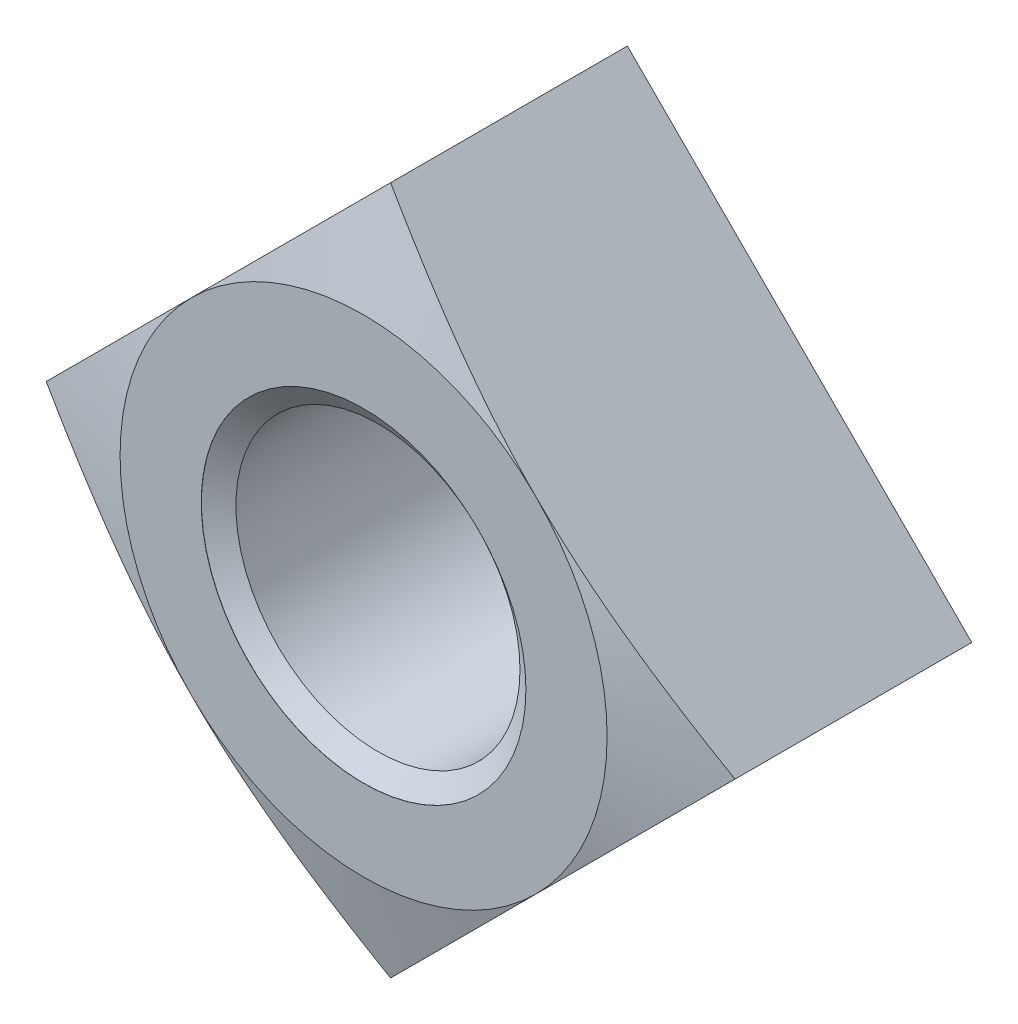
ISO-10303-21;
HEADER;
FILE_DESCRIPTION(('STEP AP214'),'2;1');
FILE_NAME('part.step','',(''),(''),'','','');
FILE_SCHEMA(('AUTOMOTIVE_DESIGN { 1 0 10303 214 1 1 1 1 }'));
ENDSEC;
DATA;
#1=APPLICATION_CONTEXT('core data for automotive mechanical design processes');
#2=APPLICATION_PROTOCOL_DEFINITION('international standard','automotive_design',2000,#1);
#3=PRODUCT_CONTEXT('',#1,'mechanical');
#4=PRODUCT('Part','Part','',(#3));
#5=PRODUCT_RELATED_PRODUCT_CATEGORY('part','',(#4));
#6=PRODUCT_DEFINITION_FORMATION('','',#4);
#7=PRODUCT_DEFINITION_CONTEXT('part definition',#1,'design');
#8=PRODUCT_DEFINITION('design','',#6,#7);
#9=PRODUCT_DEFINITION_SHAPE('','',#8);
#10=(LENGTH_UNIT() NAMED_UNIT(*) SI_UNIT(.MILLI.,.METRE.));
#11=(NAMED_UNIT(*) PLANE_ANGLE_UNIT() SI_UNIT($,.RADIAN.));
#12=(NAMED_UNIT(*) SI_UNIT($,.STERADIAN.) SOLID_ANGLE_UNIT());
#13=UNCERTAINTY_MEASURE_WITH_UNIT(LENGTH_MEASURE(1.E-05),#10,'distance_accuracy_value','');
#14=(GEOMETRIC_REPRESENTATION_CONTEXT(3) GLOBAL_UNCERTAINTY_ASSIGNED_CONTEXT((#13)) GLOBAL_UNIT_ASSIGNED_CONTEXT((#10,
#11,#12)) REPRESENTATION_CONTEXT('',''));
#15=CARTESIAN_POINT('',(0.,0.,0.));
#16=DIRECTION('',(0.,0.,1.));
#17=DIRECTION('',(1.,0.,0.));
#18=AXIS2_PLACEMENT_3D('',#15,#16,#17);
#19=CARTESIAN_POINT('',(0.,0.,-13.));
#20=DIRECTION('',(0.,0.,1.));
#21=DIRECTION('',(1.,0.,0.));
#22=AXIS2_PLACEMENT_3D('',#19,#20,#21);
#23=CYLINDRICAL_SURFACE('',#22,7.);
#24=CARTESIAN_POINT('',(0.,0.,-0.708207538209701));
#25=DIRECTION('',(0.,0.,1.));
#26=DIRECTION('',(1.,0.,0.));
#27=AXIS2_PLACEMENT_3D('',#24,#25,#26);
#28=CIRCLE('',#27,7.);
#29=CARTESIAN_POINT('',(7.,0.,-0.708207538209701));
#30=VERTEX_POINT('',#29);
#31=EDGE_CURVE('E172',#30,#30,#28,.F.);
#32=CARTESIAN_POINT('',(0.,0.,-12.2907924617903));
#33=DIRECTION('',(0.,0.,-1.));
#34=DIRECTION('',(-1.,0.,0.));
#35=AXIS2_PLACEMENT_3D('',#32,#33,#34);
#36=CIRCLE('',#35,7.);
#37=CARTESIAN_POINT('',(7.,0.,-12.2907924617903));
#38=VERTEX_POINT('',#37);
#39=EDGE_CURVE('E39',#38,#38,#36,.F.);
#40=CARTESIAN_POINT('',(7.,0.,-0.708207538209701));
#41=CARTESIAN_POINT('',(7.,0.,-0.828859464496999));
#42=CARTESIAN_POINT('',(7.,0.,-0.949511390784297));
#43=CARTESIAN_POINT('',(7.,0.,-1.19081524335889));
#44=CARTESIAN_POINT('',(7.,0.,-1.31146716964619));
#45=CARTESIAN_POINT('',(7.,0.,-1.55277102222079));
#46=CARTESIAN_POINT('',(7.,0.,-1.67342294850808));
#47=CARTESIAN_POINT('',(7.,0.,-1.91472680108268));
#48=CARTESIAN_POINT('',(7.,0.,-2.03537872736998));
#49=CARTESIAN_POINT('',(7.,0.,-2.27668257994457));
#50=CARTESIAN_POINT('',(7.,0.,-2.39733450623187));
#51=CARTESIAN_POINT('',(7.,0.,-2.63863835880647));
#52=CARTESIAN_POINT('',(7.,0.,-2.75929028509376));
#53=CARTESIAN_POINT('',(7.,0.,-3.00059413766836));
#54=CARTESIAN_POINT('',(7.,0.,-3.12124606395566));
#55=CARTESIAN_POINT('',(7.,0.,-3.36254991653025));
#56=CARTESIAN_POINT('',(7.,0.,-3.48320184281755));
#57=CARTESIAN_POINT('',(7.,0.,-3.72450569539215));
#58=CARTESIAN_POINT('',(7.,0.,-3.84515762167944));
#59=CARTESIAN_POINT('',(7.,0.,-4.08646147425404));
#60=CARTESIAN_POINT('',(7.,0.,-4.20711340054134));
#61=CARTESIAN_POINT('',(7.,0.,-4.44841725311593));
#62=CARTESIAN_POINT('',(7.,0.,-4.56906917940323));
#63=CARTESIAN_POINT('',(7.,0.,-4.81037303197783));
#64=CARTESIAN_POINT('',(7.,0.,-4.93102495826512));
#65=CARTESIAN_POINT('',(7.,0.,-5.17232881083972));
#66=CARTESIAN_POINT('',(7.,0.,-5.29298073712702));
#67=CARTESIAN_POINT('',(7.,0.,-5.53428458970161));
#68=CARTESIAN_POINT('',(7.,0.,-5.65493651598891));
#69=CARTESIAN_POINT('',(7.,0.,-5.89624036856351));
#70=CARTESIAN_POINT('',(7.,0.,-6.0168922948508));
#71=CARTESIAN_POINT('',(7.,0.,-6.2581961474254));
#72=CARTESIAN_POINT('',(7.,0.,-6.3788480737127));
#73=CARTESIAN_POINT('',(7.,0.,-6.62015192628729));
#74=CARTESIAN_POINT('',(7.,0.,-6.74080385257459));
#75=CARTESIAN_POINT('',(7.,0.,-6.98210770514919));
#76=CARTESIAN_POINT('',(7.,0.,-7.10275963143649));
#77=CARTESIAN_POINT('',(7.,0.,-7.34406348401108));
#78=CARTESIAN_POINT('',(7.,0.,-7.46471541029838));
#79=CARTESIAN_POINT('',(7.,0.,-7.70601926287297));
#80=CARTESIAN_POINT('',(7.,0.,-7.82667118916027));
#81=CARTESIAN_POINT('',(7.,0.,-8.06797504173487));
#82=CARTESIAN_POINT('',(7.,0.,-8.18862696802216));
#83=CARTESIAN_POINT('',(7.,0.,-8.42993082059676));
#84=CARTESIAN_POINT('',(7.,0.,-8.55058274688406));
#85=CARTESIAN_POINT('',(7.,0.,-8.79188659945865));
#86=CARTESIAN_POINT('',(7.,0.,-8.91253852574595));
#87=CARTESIAN_POINT('',(7.,0.,-9.15384237832055));
#88=CARTESIAN_POINT('',(7.,0.,-9.27449430460785));
#89=CARTESIAN_POINT('',(7.,0.,-9.51579815718244));
#90=CARTESIAN_POINT('',(7.,0.,-9.63645008346974));
#91=CARTESIAN_POINT('',(7.,0.,-9.87775393604433));
#92=CARTESIAN_POINT('',(7.,0.,-9.99840586233163));
#93=CARTESIAN_POINT('',(7.,0.,-10.2397097149062));
#94=CARTESIAN_POINT('',(7.,0.,-10.3603616411935));
#95=CARTESIAN_POINT('',(7.,0.,-10.6016654937681));
#96=CARTESIAN_POINT('',(7.,0.,-10.7223174200554));
#97=CARTESIAN_POINT('',(7.,0.,-10.96362127263));
#98=CARTESIAN_POINT('',(7.,0.,-11.0842731989173));
#99=CARTESIAN_POINT('',(7.,0.,-11.3255770514919));
#100=CARTESIAN_POINT('',(7.,0.,-11.4462289777792));
#101=CARTESIAN_POINT('',(7.,0.,-11.6875328303538));
#102=CARTESIAN_POINT('',(7.,0.,-11.8081847566411));
#103=CARTESIAN_POINT('',(7.,0.,-12.0494886092157));
#104=CARTESIAN_POINT('',(7.,0.,-12.170140535503));
#105=CARTESIAN_POINT('',(7.,0.,-12.2907924617903));
#106=B_SPLINE_CURVE_WITH_KNOTS('',3,(#40,#41,#42,#43,#44,#45,#46,#47,#48,#49,#50,#51,#52,#53,
#54,#55,#56,#57,#58,#59,#60,#61,#62,#63,#64,#65,#66,#67,#68,#69,#70,#71,#72,#73,#74,#75,#76,#77,
#78,#79,#80,#81,#82,#83,#84,#85,#86,#87,#88,#89,#90,#91,#92,#93,#94,#95,#96,#97,#98,#99,#100,
#101,#102,#103,#104,#105),.UNSPECIFIED.,.F.,.F.,(4,2,2,2,2,2,2,2,2,2,2,2,2,2,2,2,2,2,2,2,2,2,2,
2,2,2,2,2,2,2,2,2,4),(0.,0.361955778861894,0.723911557723786,1.08586733658568,1.44782311544757,
1.80977889430947,2.17173467317136,2.53369045203325,2.89564623089515,3.25760200975704,
3.61955778861893,3.98151356748083,4.34346934634272,4.70542512520461,5.06738090406651,
5.4293366829284,5.79129246179029,6.15324824065219,6.51520401951408,6.87715979837597,
7.23911557723787,7.60107135609976,7.96302713496165,8.32498291382355,8.68693869268544,
9.04889447154733,9.41085025040923,9.77280602927112,10.134761808133,10.4967175869949,
10.8586733658568,11.2206291447187,11.5825849235806),.UNSPECIFIED.);
#107=EDGE_CURVE('BSEAM34',#30,#38,#106,.T.);
#108=ORIENTED_EDGE('',*,*,#31,.F.);
#109=ORIENTED_EDGE('',*,*,#39,.F.);
#110=ORIENTED_EDGE('',*,*,#107,.T.);
#111=ORIENTED_EDGE('',*,*,#107,.F.);
#112=EDGE_LOOP('',(#108,#110,#109,#111));
#113=FACE_BOUND('',#112,.T.);
#114=ADVANCED_FACE('F34',(#113),#23,.F.);
#115=CARTESIAN_POINT('',(0.,-16.9705627484771,-13.));
#116=DIRECTION('',(0.707106781186548,-0.707106781186547,0.));
#117=DIRECTION('',(0.707106781186547,0.707106781186548,0.));
#118=AXIS2_PLACEMENT_3D('',#115,#116,#117);
#119=PLANE('',#118);
#120=DIRECTION('',(0.,0.,1.));
#121=VECTOR('',#120,1.);
#122=CARTESIAN_POINT('',(16.9705627484771,0.,-13.));
#123=LINE('',#122,#121);
#124=CARTESIAN_POINT('',(16.9705627484771,0.,-13.));
#125=VERTEX_POINT('',#124);
#126=CARTESIAN_POINT('',(16.9705627484771,0.,-1.33185827438266));
#127=VERTEX_POINT('',#126);
#128=EDGE_CURVE('E163',#125,#127,#123,.T.);
#129=ORIENTED_EDGE('',*,*,#128,.T.);
#130=CARTESIAN_POINT('',(16.9707627484771,0.000200000000001266,-1.33191186453692));
#131=CARTESIAN_POINT('',(16.7160871689827,-0.254475579494484,-1.26368267582354));
#132=CARTESIAN_POINT('',(16.4612127638952,-0.509349984581982,-1.19691326985119));
#133=CARTESIAN_POINT('',(15.9510162592175,-1.01954648925967,-1.0667933943211));
#134=CARTESIAN_POINT('',(15.6956941392983,-1.27486860917886,-1.00344308439163));
#135=CARTESIAN_POINT('',(15.1844078591732,-1.78615488930396,-0.880626862455069));
#136=CARTESIAN_POINT('',(14.9284433871733,-2.04211936130388,-0.821163532213176));
#137=CARTESIAN_POINT('',(14.4160134005023,-2.55454934797482,-0.706762615968221));
#138=CARTESIAN_POINT('',(14.1595478915117,-2.81101485696542,-0.651824978957183));
#139=CARTESIAN_POINT('',(13.3887812697204,-3.58178147875671,-0.494643727278841));
#140=CARTESIAN_POINT('',(12.8736681962786,-4.09689455219855,-0.400168632033365));
#141=CARTESIAN_POINT('',(11.841395432082,-5.1291673163951,-0.237805323419943));
#142=CARTESIAN_POINT('',(11.3242362040809,-5.64632654439629,-0.169911410884996));
#143=CARTESIAN_POINT('',(10.5512179903715,-6.4193447581056,-0.0926130125675545));
#144=CARTESIAN_POINT('',(10.2959571207786,-6.67460562769855,-0.0710120553962755));
#145=CARTESIAN_POINT('',(9.78514714254055,-7.18541560593659,-0.036117858776914));
#146=CARTESIAN_POINT('',(9.5295980345371,-7.44096471394004,-0.022824600871827));
#147=CARTESIAN_POINT('',(9.01834367853458,-7.95221906994257,-0.0048944478908159));
#148=CARTESIAN_POINT('',(8.76263842835409,-8.20792432012305,-0.000257676654077014));
#149=CARTESIAN_POINT('',(8.25122407475896,-8.71933867371819,0.000236744622834916));
#150=CARTESIAN_POINT('',(7.99551497134956,-8.97504777712758,-0.00390559428812388));
#151=CARTESIAN_POINT('',(7.48449927368456,-9.48606347479259,-0.0208514195087557));
#152=CARTESIAN_POINT('',(7.22919253390913,-9.74137021456801,-0.0336461412863514));
#153=CARTESIAN_POINT('',(6.71886010607429,-10.2517026424028,-0.0675520992348062));
#154=CARTESIAN_POINT('',(6.46383441994363,-10.5067283285335,-0.0886633921262399));
#155=CARTESIAN_POINT('',(5.69934239699318,-11.271220351484,-0.163734393907898));
#156=CARTESIAN_POINT('',(5.19043259389555,-11.7801301545816,-0.229432271020398));
#157=CARTESIAN_POINT('',(4.4868931773749,-12.4836695711022,-0.338449897497542));
#158=CARTESIAN_POINT('',(4.29135123541936,-12.6792115130578,-0.370704695444403));
#159=CARTESIAN_POINT('',(3.90058562169434,-13.0699771267828,-0.438740581818086));
#160=CARTESIAN_POINT('',(3.70536192766991,-13.2652008208072,-0.474521411882843));
#161=CARTESIAN_POINT('',(3.12010609596811,-13.850456652509,-0.586688719894474));
#162=CARTESIAN_POINT('',(2.73053498855165,-14.2400277599255,-0.66789277162461));
#163=CARTESIAN_POINT('',(1.95007997316359,-15.0204827753136,-0.841333622914572));
#164=CARTESIAN_POINT('',(1.55920362423867,-15.4113591242385,-0.933637717196592));
#165=CARTESIAN_POINT('',(0.973762906128067,-15.9967998423491,-1.07850911954513));
#166=CARTESIAN_POINT('',(0.778796386350297,-16.1917663621268,-1.12785940828177));
#167=CARTESIAN_POINT('',(0.389114832454074,-16.5814479160231,-1.2284905074395));
#168=CARTESIAN_POINT('',(0.194399795370428,-16.7761629531067,-1.27977129487944));
#169=CARTESIAN_POINT('',(-0.000199999999999715,-16.9707627484771,-1.33191186453692));
#170=B_SPLINE_CURVE_WITH_KNOTS('',3,(#130,#131,#132,#133,#134,#135,#136,#137,#138,#139,#140,
#141,#142,#143,#144,#145,#146,#147,#148,#149,#150,#151,#152,#153,#154,#155,#156,#157,#158,#159,
#160,#161,#162,#163,#164,#165,#166,#167,#168,#169),.UNSPECIFIED.,.F.,.F.,(4,2,2,2,2,2,2,2,2,2,2,
2,2,2,2,2,2,2,2,4),(0.,1.09971744747032,2.19948619341731,3.29997814453787,4.40045769058671,
6.60381929577945,8.80670822781167,9.89154414633702,10.9763776547014,12.0612266825107,
13.1460743449941,14.2298247412125,15.3135825289398,17.4809772471889,18.3162064511189,
19.1513745009496,20.8219059859292,22.5031307537072,23.3434429539036,24.1837451539676),.UNSPECIFIED.);
#171=CARTESIAN_POINT('',(8.48528137423857,-8.48528137423857,0.));
#172=VERTEX_POINT('',#171);
#173=EDGE_CURVE('E60',#127,#172,#170,.T.);
#174=ORIENTED_EDGE('',*,*,#173,.T.);
#175=CARTESIAN_POINT('',(0.,-16.9705627484771,-1.33185827438266));
#176=VERTEX_POINT('',#175);
#177=EDGE_CURVE('E146',#172,#176,#170,.T.);
#178=ORIENTED_EDGE('',*,*,#177,.T.);
#179=DIRECTION('',(0.,0.,1.));
#180=VECTOR('',#179,1.);
#181=CARTESIAN_POINT('',(0.,-16.9705627484771,-13.));
#182=LINE('',#181,#180);
#183=CARTESIAN_POINT('',(0.,-16.9705627484771,-13.));
#184=VERTEX_POINT('',#183);
#185=EDGE_CURVE('E164',#184,#176,#182,.T.);
#186=ORIENTED_EDGE('',*,*,#185,.F.);
#187=DIRECTION('',(0.707106781186547,0.707106781186548,0.));
#188=VECTOR('',#187,1.);
#189=CARTESIAN_POINT('',(0.,-16.9705627484771,-13.));
#190=LINE('',#189,#188);
#191=EDGE_CURVE('E152',#184,#125,#190,.T.);
#192=ORIENTED_EDGE('',*,*,#191,.T.);
#193=EDGE_LOOP('',(#129,#174,#178,#186,#192));
#194=FACE_BOUND('',#193,.T.);
#195=ADVANCED_FACE('F36',(#194),#119,.T.);
#196=CARTESIAN_POINT('',(-16.9705627484771,0.,-13.));
#197=DIRECTION('',(-0.707106781186548,-0.707106781186547,0.));
#198=DIRECTION('',(0.707106781186547,-0.707106781186548,0.));
#199=AXIS2_PLACEMENT_3D('',#196,#197,#198);
#200=PLANE('',#199);
#201=ORIENTED_EDGE('',*,*,#185,.T.);
#202=CARTESIAN_POINT('',(0.000200000000000619,-16.9707627484771,-1.33191186453692));
#203=CARTESIAN_POINT('',(-0.254475579494483,-16.7160871689827,-1.26368267582354));
#204=CARTESIAN_POINT('',(-0.509349984581981,-16.4612127638952,-1.19691326985119));
#205=CARTESIAN_POINT('',(-1.01954648925967,-15.9510162592175,-1.0667933943211));
#206=CARTESIAN_POINT('',(-1.27486860917886,-15.6956941392983,-1.00344308439164));
#207=CARTESIAN_POINT('',(-1.78615488930397,-15.1844078591732,-0.880626862455071));
#208=CARTESIAN_POINT('',(-2.04211936130388,-14.9284433871733,-0.821163532213177));
#209=CARTESIAN_POINT('',(-2.55454934797483,-14.4160134005023,-0.706762615968221));
#210=CARTESIAN_POINT('',(-2.81101485696542,-14.1595478915117,-0.651824978957184));
#211=CARTESIAN_POINT('',(-3.58178147875671,-13.3887812697204,-0.494643727278842));
#212=CARTESIAN_POINT('',(-4.09689455219855,-12.8736681962786,-0.400168632033366));
#213=CARTESIAN_POINT('',(-5.1291673163951,-11.8413954320821,-0.237805323419944));
#214=CARTESIAN_POINT('',(-5.64632654439629,-11.3242362040809,-0.169911410884997));
#215=CARTESIAN_POINT('',(-6.4193447581056,-10.5512179903715,-0.092613012567555));
#216=CARTESIAN_POINT('',(-6.67460562769855,-10.2959571207786,-0.0710120553962758));
#217=CARTESIAN_POINT('',(-7.18541560593659,-9.78514714254056,-0.0361178587769143));
#218=CARTESIAN_POINT('',(-7.44096471394004,-9.5295980345371,-0.0228246008718276));
#219=CARTESIAN_POINT('',(-7.95221906994257,-9.01834367853458,-0.00489444789081629));
#220=CARTESIAN_POINT('',(-8.20792432012305,-8.7626384283541,-0.000257676654077003));
#221=CARTESIAN_POINT('',(-8.71933867371818,-8.25122407475896,0.000236744622834906));
#222=CARTESIAN_POINT('',(-8.97504777712758,-7.99551497134956,-0.00390559428812433));
#223=CARTESIAN_POINT('',(-9.48606347479259,-7.48449927368456,-0.0208514195087566));
#224=CARTESIAN_POINT('',(-9.74137021456802,-7.22919253390913,-0.0336461412863523));
#225=CARTESIAN_POINT('',(-10.2517026424028,-6.7188601060743,-0.0675520992348067));
#226=CARTESIAN_POINT('',(-10.5067283285335,-6.46383441994363,-0.08866339212624));
#227=CARTESIAN_POINT('',(-11.271220351484,-5.69934239699318,-0.163734393907897));
#228=CARTESIAN_POINT('',(-11.7801301545816,-5.19043259389555,-0.229432271020399));
#229=CARTESIAN_POINT('',(-12.4836695711023,-4.48689317737489,-0.338449897497543));
#230=CARTESIAN_POINT('',(-12.6792115130578,-4.29135123541936,-0.370704695444404));
#231=CARTESIAN_POINT('',(-13.0699771267828,-3.90058562169433,-0.438740581818087));
#232=CARTESIAN_POINT('',(-13.2652008208072,-3.70536192766991,-0.474521411882843));
#233=CARTESIAN_POINT('',(-13.850456652509,-3.12010609596811,-0.586688719894475));
#234=CARTESIAN_POINT('',(-14.2400277599255,-2.73053498855165,-0.667892771624611));
#235=CARTESIAN_POINT('',(-15.0204827753136,-1.95007997316358,-0.841333622914571));
#236=CARTESIAN_POINT('',(-15.4113591242385,-1.55920362423867,-0.933637717196592));
#237=CARTESIAN_POINT('',(-15.9967998423491,-0.973762906128066,-1.07850911954513));
#238=CARTESIAN_POINT('',(-16.1917663621268,-0.778796386350297,-1.12785940828177));
#239=CARTESIAN_POINT('',(-16.5814479160231,-0.389114832454074,-1.2284905074395));
#240=CARTESIAN_POINT('',(-16.7761629531067,-0.194399795370428,-1.27977129487944));
#241=CARTESIAN_POINT('',(-16.9707627484771,0.000200000000000152,-1.33191186453692));
#242=B_SPLINE_CURVE_WITH_KNOTS('',3,(#202,#203,#204,#205,#206,#207,#208,#209,#210,#211,#212,
#213,#214,#215,#216,#217,#218,#219,#220,#221,#222,#223,#224,#225,#226,#227,#228,#229,#230,#231,
#232,#233,#234,#235,#236,#237,#238,#239,#240,#241),.UNSPECIFIED.,.F.,.F.,(4,2,2,2,2,2,2,2,2,2,2,
2,2,2,2,2,2,2,2,4),(0.,1.09971744747032,2.19948619341731,3.29997814453788,4.40045769058671,
6.60381929577945,8.80670822781167,9.89154414633702,10.9763776547014,12.0612266825107,
13.1460743449941,14.2298247412125,15.3135825289398,17.4809772471889,18.3162064511189,
19.1513745009496,20.8219059859292,22.5031307537072,23.3434429539036,24.1837451539676),.UNSPECIFIED.);
#243=CARTESIAN_POINT('',(-8.48528137423857,-8.48528137423857,0.));
#244=VERTEX_POINT('',#243);
#245=EDGE_CURVE('E117',#176,#244,#242,.T.);
#246=ORIENTED_EDGE('',*,*,#245,.T.);
#247=CARTESIAN_POINT('',(-16.9705627484771,0.,-1.33185827438266));
#248=VERTEX_POINT('',#247);
#249=EDGE_CURVE('E103',#244,#248,#242,.T.);
#250=ORIENTED_EDGE('',*,*,#249,.T.);
#251=DIRECTION('',(0.,0.,1.));
#252=VECTOR('',#251,1.);
#253=CARTESIAN_POINT('',(-16.9705627484771,0.,-13.));
#254=LINE('',#253,#252);
#255=CARTESIAN_POINT('',(-16.9705627484771,0.,-13.));
#256=VERTEX_POINT('',#255);
#257=EDGE_CURVE('E116',#256,#248,#254,.T.);
#258=ORIENTED_EDGE('',*,*,#257,.F.);
#259=DIRECTION('',(0.707106781186547,-0.707106781186548,0.));
#260=VECTOR('',#259,1.);
#261=CARTESIAN_POINT('',(-16.9705627484771,0.,-13.));
#262=LINE('',#261,#260);
#263=EDGE_CURVE('E160',#256,#184,#262,.T.);
#264=ORIENTED_EDGE('',*,*,#263,.T.);
#265=EDGE_LOOP('',(#201,#246,#250,#258,#264));
#266=FACE_BOUND('',#265,.T.);
#267=ADVANCED_FACE('F209',(#266),#200,.T.);
#268=CARTESIAN_POINT('',(0.,16.9705627484771,-13.));
#269=DIRECTION('',(-0.707106781186548,0.707106781186548,0.));
#270=DIRECTION('',(-0.707106781186548,-0.707106781186548,0.));
#271=AXIS2_PLACEMENT_3D('',#268,#269,#270);
#272=PLANE('',#271);
#273=ORIENTED_EDGE('',*,*,#257,.T.);
#274=CARTESIAN_POINT('',(-16.9707627484771,-0.000199999999998812,-1.33191186453692));
#275=CARTESIAN_POINT('',(-16.7160871689827,0.254475579494485,-1.26368267582354));
#276=CARTESIAN_POINT('',(-16.4612127638952,0.509349984581982,-1.19691326985119));
#277=CARTESIAN_POINT('',(-15.9510162592175,1.01954648925967,-1.0667933943211));
#278=CARTESIAN_POINT('',(-15.6956941392983,1.27486860917886,-1.00344308439163));
#279=CARTESIAN_POINT('',(-15.1844078591732,1.78615488930397,-0.88062686245507));
#280=CARTESIAN_POINT('',(-14.9284433871733,2.04211936130389,-0.821163532213177));
#281=CARTESIAN_POINT('',(-14.4160134005023,2.55454934797483,-0.706762615968221));
#282=CARTESIAN_POINT('',(-14.1595478915117,2.81101485696542,-0.651824978957183));
#283=CARTESIAN_POINT('',(-13.3887812697204,3.58178147875671,-0.494643727278841));
#284=CARTESIAN_POINT('',(-12.8736681962786,4.09689455219855,-0.400168632033366));
#285=CARTESIAN_POINT('',(-11.841395432082,5.1291673163951,-0.237805323419944));
#286=CARTESIAN_POINT('',(-11.3242362040809,5.64632654439629,-0.169911410884996));
#287=CARTESIAN_POINT('',(-10.5512179903715,6.4193447581056,-0.0926130125675545));
#288=CARTESIAN_POINT('',(-10.2959571207786,6.67460562769855,-0.0710120553962755));
#289=CARTESIAN_POINT('',(-9.78514714254055,7.18541560593659,-0.0361178587769141));
#290=CARTESIAN_POINT('',(-9.5295980345371,7.44096471394004,-0.0228246008718273));
#291=CARTESIAN_POINT('',(-9.01834367853458,7.95221906994257,-0.00489444789081609));
#292=CARTESIAN_POINT('',(-8.76263842835409,8.20792432012305,-0.000257676654076991));
#293=CARTESIAN_POINT('',(-8.25122407475896,8.71933867371819,0.000236744622834893));
#294=CARTESIAN_POINT('',(-7.99551497134956,8.97504777712758,-0.00390559428812419));
#295=CARTESIAN_POINT('',(-7.48449927368456,9.48606347479259,-0.0208514195087562));
#296=CARTESIAN_POINT('',(-7.22919253390913,9.74137021456802,-0.0336461412863519));
#297=CARTESIAN_POINT('',(-6.71886010607429,10.2517026424028,-0.0675520992348066));
#298=CARTESIAN_POINT('',(-6.46383441994363,10.5067283285335,-0.0886633921262402));
#299=CARTESIAN_POINT('',(-5.69934239699318,11.271220351484,-0.163734393907898));
#300=CARTESIAN_POINT('',(-5.19043259389555,11.7801301545816,-0.229432271020398));
#301=CARTESIAN_POINT('',(-4.4868931773749,12.4836695711022,-0.338449897497542));
#302=CARTESIAN_POINT('',(-4.29135123541936,12.6792115130578,-0.370704695444404));
#303=CARTESIAN_POINT('',(-3.90058562169434,13.0699771267828,-0.438740581818087));
#304=CARTESIAN_POINT('',(-3.70536192766991,13.2652008208072,-0.474521411882843));
#305=CARTESIAN_POINT('',(-3.12010609596811,13.850456652509,-0.586688719894474));
#306=CARTESIAN_POINT('',(-2.73053498855165,14.2400277599255,-0.66789277162461));
#307=CARTESIAN_POINT('',(-1.95007997316359,15.0204827753136,-0.841333622914571));
#308=CARTESIAN_POINT('',(-1.55920362423867,15.4113591242385,-0.933637717196592));
#309=CARTESIAN_POINT('',(-0.973762906128068,15.9967998423491,-1.07850911954513));
#310=CARTESIAN_POINT('',(-0.778796386350299,16.1917663621268,-1.12785940828177));
#311=CARTESIAN_POINT('',(-0.389114832454076,16.5814479160231,-1.2284905074395));
#312=CARTESIAN_POINT('',(-0.19439979537043,16.7761629531067,-1.27977129487944));
#313=CARTESIAN_POINT('',(0.000199999999997541,16.9707627484771,-1.33191186453692));
#314=B_SPLINE_CURVE_WITH_KNOTS('',3,(#274,#275,#276,#277,#278,#279,#280,#281,#282,#283,#284,
#285,#286,#287,#288,#289,#290,#291,#292,#293,#294,#295,#296,#297,#298,#299,#300,#301,#302,#303,
#304,#305,#306,#307,#308,#309,#310,#311,#312,#313),.UNSPECIFIED.,.F.,.F.,(4,2,2,2,2,2,2,2,2,2,2,
2,2,2,2,2,2,2,2,4),(0.,1.09971744747031,2.19948619341731,3.29997814453787,4.40045769058671,
6.60381929577945,8.80670822781167,9.89154414633702,10.9763776547014,12.0612266825107,
13.1460743449941,14.2298247412125,15.3135825289398,17.4809772471889,18.3162064511189,
19.1513745009496,20.8219059859292,22.5031307537072,23.3434429539035,24.1837451539676),.UNSPECIFIED.);
#315=CARTESIAN_POINT('',(-8.48528137423857,8.48528137423857,0.));
#316=VERTEX_POINT('',#315);
#317=EDGE_CURVE('E98',#248,#316,#314,.T.);
#318=ORIENTED_EDGE('',*,*,#317,.T.);
#319=CARTESIAN_POINT('',(0.,16.9705627484771,-1.33185827438266));
#320=VERTEX_POINT('',#319);
#321=EDGE_CURVE('E90',#316,#320,#314,.T.);
#322=ORIENTED_EDGE('',*,*,#321,.T.);
#323=DIRECTION('',(0.,0.,1.));
#324=VECTOR('',#323,1.);
#325=CARTESIAN_POINT('',(0.,16.9705627484771,-13.));
#326=LINE('',#325,#324);
#327=CARTESIAN_POINT('',(0.,16.9705627484771,-13.));
#328=VERTEX_POINT('',#327);
#329=EDGE_CURVE('E168',#328,#320,#326,.T.);
#330=ORIENTED_EDGE('',*,*,#329,.F.);
#331=DIRECTION('',(-0.707106781186547,-0.707106781186547,0.));
#332=VECTOR('',#331,1.);
#333=CARTESIAN_POINT('',(0.,16.9705627484771,-13.));
#334=LINE('',#333,#332);
#335=EDGE_CURVE('E158',#328,#256,#334,.T.);
#336=ORIENTED_EDGE('',*,*,#335,.T.);
#337=EDGE_LOOP('',(#273,#318,#322,#330,#336));
#338=FACE_BOUND('',#337,.T.);
#339=ADVANCED_FACE('F114',(#338),#272,.T.);
#340=CARTESIAN_POINT('',(16.9705627484771,0.,-13.));
#341=DIRECTION('',(0.707106781186548,0.707106781186548,0.));
#342=DIRECTION('',(-0.707106781186548,0.707106781186548,0.));
#343=AXIS2_PLACEMENT_3D('',#340,#341,#342);
#344=PLANE('',#343);
#345=ORIENTED_EDGE('',*,*,#329,.T.);
#346=CARTESIAN_POINT('',(-0.000200000000001822,16.9707627484771,-1.33191186453692));
#347=CARTESIAN_POINT('',(0.254475579494483,16.7160871689827,-1.26368267582354));
#348=CARTESIAN_POINT('',(0.50934998458198,16.4612127638952,-1.19691326985119));
#349=CARTESIAN_POINT('',(1.01954648925967,15.9510162592175,-1.0667933943211));
#350=CARTESIAN_POINT('',(1.27486860917886,15.6956941392983,-1.00344308439163));
#351=CARTESIAN_POINT('',(1.78615488930396,15.1844078591732,-0.880626862455071));
#352=CARTESIAN_POINT('',(2.04211936130388,14.9284433871733,-0.821163532213177));
#353=CARTESIAN_POINT('',(2.55454934797482,14.4160134005023,-0.706762615968221));
#354=CARTESIAN_POINT('',(2.81101485696542,14.1595478915117,-0.651824978957183));
#355=CARTESIAN_POINT('',(3.5817814787567,13.3887812697204,-0.49464372727884));
#356=CARTESIAN_POINT('',(4.09689455219855,12.8736681962786,-0.400168632033365));
#357=CARTESIAN_POINT('',(5.1291673163951,11.841395432082,-0.237805323419943));
#358=CARTESIAN_POINT('',(5.64632654439629,11.3242362040809,-0.169911410884995));
#359=CARTESIAN_POINT('',(6.4193447581056,10.5512179903715,-0.0926130125675549));
#360=CARTESIAN_POINT('',(6.67460562769855,10.2959571207786,-0.0710120553962764));
#361=CARTESIAN_POINT('',(7.18541560593659,9.78514714254056,-0.0361178587769145));
#362=CARTESIAN_POINT('',(7.44096471394004,9.5295980345371,-0.0228246008718267));
#363=CARTESIAN_POINT('',(7.95221906994256,9.01834367853458,-0.00489444789081527));
#364=CARTESIAN_POINT('',(8.20792432012305,8.7626384283541,-0.000257676654076863));
#365=CARTESIAN_POINT('',(8.71933867371818,8.25122407475896,0.000236744622834765));
#366=CARTESIAN_POINT('',(8.97504777712758,7.99551497134956,-0.00390559428812387));
#367=CARTESIAN_POINT('',(9.48606347479258,7.48449927368456,-0.0208514195087556));
#368=CARTESIAN_POINT('',(9.74137021456801,7.22919253390913,-0.0336461412863515));
#369=CARTESIAN_POINT('',(10.2517026424028,6.7188601060743,-0.0675520992348061));
#370=CARTESIAN_POINT('',(10.5067283285335,6.46383441994363,-0.0886633921262396));
#371=CARTESIAN_POINT('',(11.271220351484,5.69934239699318,-0.163734393907897));
#372=CARTESIAN_POINT('',(11.7801301545816,5.19043259389555,-0.229432271020398));
#373=CARTESIAN_POINT('',(12.4836695711022,4.4868931773749,-0.338449897497542));
#374=CARTESIAN_POINT('',(12.6792115130578,4.29135123541936,-0.370704695444403));
#375=CARTESIAN_POINT('',(13.0699771267828,3.90058562169434,-0.438740581818086));
#376=CARTESIAN_POINT('',(13.2652008208072,3.70536192766991,-0.474521411882843));
#377=CARTESIAN_POINT('',(13.850456652509,3.12010609596811,-0.586688719894474));
#378=CARTESIAN_POINT('',(14.2400277599255,2.73053498855165,-0.66789277162461));
#379=CARTESIAN_POINT('',(15.0204827753136,1.95007997316358,-0.841333622914571));
#380=CARTESIAN_POINT('',(15.4113591242385,1.55920362423867,-0.933637717196592));
#381=CARTESIAN_POINT('',(15.9967998423491,0.973762906128064,-1.07850911954513));
#382=CARTESIAN_POINT('',(16.1917663621268,0.778796386350294,-1.12785940828177));
#383=CARTESIAN_POINT('',(16.5814479160231,0.389114832454071,-1.2284905074395));
#384=CARTESIAN_POINT('',(16.7761629531067,0.194399795370426,-1.27977129487944));
#385=CARTESIAN_POINT('',(16.9707627484771,-0.000199999999999034,-1.33191186453692));
#386=B_SPLINE_CURVE_WITH_KNOTS('',3,(#346,#347,#348,#349,#350,#351,#352,#353,#354,#355,#356,
#357,#358,#359,#360,#361,#362,#363,#364,#365,#366,#367,#368,#369,#370,#371,#372,#373,#374,#375,
#376,#377,#378,#379,#380,#381,#382,#383,#384,#385),.UNSPECIFIED.,.F.,.F.,(4,2,2,2,2,2,2,2,2,2,2,
2,2,2,2,2,2,2,2,4),(0.,1.09971744747032,2.1994861934173,3.29997814453788,4.40045769058671,
6.60381929577945,8.80670822781167,9.89154414633701,10.9763776547014,12.0612266825107,
13.1460743449941,14.2298247412125,15.3135825289398,17.4809772471889,18.3162064511189,
19.1513745009496,20.8219059859292,22.5031307537072,23.3434429539036,24.1837451539676),.UNSPECIFIED.);
#387=CARTESIAN_POINT('',(8.48528137423857,8.48528137423857,0.));
#388=VERTEX_POINT('',#387);
#389=EDGE_CURVE('E94',#320,#388,#386,.T.);
#390=ORIENTED_EDGE('',*,*,#389,.T.);
#391=EDGE_CURVE('E110',#388,#127,#386,.T.);
#392=ORIENTED_EDGE('',*,*,#391,.T.);
#393=ORIENTED_EDGE('',*,*,#128,.F.);
#394=DIRECTION('',(-0.707106781186547,0.707106781186547,0.));
#395=VECTOR('',#394,1.);
#396=CARTESIAN_POINT('',(16.9705627484771,0.,-13.));
#397=LINE('',#396,#395);
#398=EDGE_CURVE('E155',#125,#328,#397,.T.);
#399=ORIENTED_EDGE('',*,*,#398,.T.);
#400=EDGE_LOOP('',(#345,#390,#392,#393,#399));
#401=FACE_BOUND('',#400,.T.);
#402=ADVANCED_FACE('F222',(#401),#344,.T.);
#403=CARTESIAN_POINT('',(16.9705627484771,0.,0.));
#404=DIRECTION('',(0.,0.,1.));
#405=DIRECTION('',(1.,0.,0.));
#406=AXIS2_PLACEMENT_3D('',#403,#404,#405);
#407=PLANE('',#406);
#408=CARTESIAN_POINT('',(0.,0.,0.));
#409=DIRECTION('',(0.,0.,1.));
#410=DIRECTION('',(1.,0.,0.));
#411=AXIS2_PLACEMENT_3D('',#408,#409,#410);
#412=CIRCLE('',#411,8.);
#413=CARTESIAN_POINT('',(8.,0.,0.));
#414=VERTEX_POINT('',#413);
#415=EDGE_CURVE('E111',#414,#414,#412,.F.);
#416=ORIENTED_EDGE('',*,*,#415,.T.);
#417=EDGE_LOOP('',(#416));
#418=FACE_BOUND('',#417,.T.);
#419=CARTESIAN_POINT('',(0.,0.,0.));
#420=DIRECTION('',(0.,0.,1.));
#421=DIRECTION('',(1.,0.,0.));
#422=AXIS2_PLACEMENT_3D('',#419,#420,#421);
#423=CIRCLE('',#422,12.);
#424=EDGE_CURVE('E46',#172,#388,#423,.T.);
#425=ORIENTED_EDGE('',*,*,#424,.T.);
#426=CARTESIAN_POINT('',(0.,0.,0.));
#427=DIRECTION('',(0.,0.,1.));
#428=DIRECTION('',(1.,0.,0.));
#429=AXIS2_PLACEMENT_3D('',#426,#427,#428);
#430=CIRCLE('',#429,12.);
#431=EDGE_CURVE('E53',#388,#316,#430,.T.);
#432=ORIENTED_EDGE('',*,*,#431,.T.);
#433=EDGE_CURVE('E11',#316,#244,#423,.T.);
#434=ORIENTED_EDGE('',*,*,#433,.T.);
#435=EDGE_CURVE('E44',#244,#172,#423,.T.);
#436=ORIENTED_EDGE('',*,*,#435,.T.);
#437=EDGE_LOOP('',(#425,#432,#434,#436));
#438=FACE_BOUND('',#437,.T.);
#439=ADVANCED_FACE('F109',(#418,#438),#407,.T.);
#440=CARTESIAN_POINT('',(16.9705627484771,0.,-13.));
#441=DIRECTION('',(0.,0.,1.));
#442=DIRECTION('',(1.,0.,0.));
#443=AXIS2_PLACEMENT_3D('',#440,#441,#442);
#444=PLANE('',#443);
#445=CARTESIAN_POINT('',(0.,0.,-13.));
#446=DIRECTION('',(0.,0.,1.));
#447=DIRECTION('',(1.,0.,0.));
#448=AXIS2_PLACEMENT_3D('',#445,#446,#447);
#449=CIRCLE('',#448,8.);
#450=CARTESIAN_POINT('',(8.,0.,-13.));
#451=VERTEX_POINT('',#450);
#452=EDGE_CURVE('E177',#451,#451,#449,.F.);
#453=ORIENTED_EDGE('',*,*,#452,.F.);
#454=EDGE_LOOP('',(#453));
#455=FACE_BOUND('',#454,.T.);
#456=ORIENTED_EDGE('',*,*,#191,.F.);
#457=ORIENTED_EDGE('',*,*,#263,.F.);
#458=ORIENTED_EDGE('',*,*,#335,.F.);
#459=ORIENTED_EDGE('',*,*,#398,.F.);
#460=EDGE_LOOP('',(#456,#457,#458,#459));
#461=FACE_BOUND('',#460,.T.);
#462=ADVANCED_FACE('F225',(#455,#461),#444,.F.);
#463=CARTESIAN_POINT('',(0.,0.,0.));
#464=DIRECTION('',(0.,0.,-1.));
#465=DIRECTION('',(-1.,0.,0.));
#466=AXIS2_PLACEMENT_3D('',#463,#464,#465);
#467=CONICAL_SURFACE('',#466,12.,1.30899693899575);
#468=ORIENTED_EDGE('',*,*,#391,.F.);
#469=ORIENTED_EDGE('',*,*,#424,.F.);
#470=ORIENTED_EDGE('',*,*,#173,.F.);
#471=EDGE_LOOP('',(#468,#469,#470));
#472=FACE_BOUND('',#471,.T.);
#473=ADVANCED_FACE('F139',(#472),#467,.T.);
#474=ORIENTED_EDGE('',*,*,#435,.F.);
#475=ORIENTED_EDGE('',*,*,#245,.F.);
#476=ORIENTED_EDGE('',*,*,#177,.F.);
#477=EDGE_LOOP('',(#474,#475,#476));
#478=FACE_BOUND('',#477,.T.);
#479=ADVANCED_FACE('F228',(#478),#467,.T.);
#480=ORIENTED_EDGE('',*,*,#433,.F.);
#481=ORIENTED_EDGE('',*,*,#317,.F.);
#482=ORIENTED_EDGE('',*,*,#249,.F.);
#483=EDGE_LOOP('',(#480,#481,#482));
#484=FACE_BOUND('',#483,.T.);
#485=ADVANCED_FACE('F101',(#484),#467,.T.);
#486=ORIENTED_EDGE('',*,*,#431,.F.);
#487=ORIENTED_EDGE('',*,*,#389,.F.);
#488=ORIENTED_EDGE('',*,*,#321,.F.);
#489=EDGE_LOOP('',(#486,#487,#488));
#490=FACE_BOUND('',#489,.T.);
#491=ADVANCED_FACE('F92',(#490),#467,.T.);
#492=CARTESIAN_POINT('',(0.,0.,-0.778228292030673));
#493=DIRECTION('',(0.,0.,1.));
#494=DIRECTION('',(1.,0.,0.));
#495=AXIS2_PLACEMENT_3D('',#492,#493,#494);
#496=CONICAL_SURFACE('',#495,6.9,0.959931088596885);
#497=CARTESIAN_POINT('',(0.,0.,-0.00799999999999759));
#498=DIRECTION('',(0.,0.,1.));
#499=DIRECTION('',(1.,0.,0.));
#500=AXIS2_PLACEMENT_3D('',#497,#498,#499);
#501=CIRCLE('',#500,8.);
#502=CARTESIAN_POINT('',(8.,0.,-0.00799999999999759));
#503=VERTEX_POINT('',#502);
#504=EDGE_CURVE('E175',#503,#503,#501,.T.);
#505=ORIENTED_EDGE('',*,*,#504,.T.);
#506=EDGE_LOOP('',(#505));
#507=FACE_BOUND('',#506,.T.);
#508=ORIENTED_EDGE('',*,*,#31,.T.);
#509=EDGE_LOOP('',(#508));
#510=FACE_BOUND('',#509,.T.);
#511=ADVANCED_FACE('F138',(#507,#510),#496,.F.);
#512=CARTESIAN_POINT('',(0.,0.,-25.0375057290932));
#513=DIRECTION('',(0.,0.,1.));
#514=DIRECTION('',(1.,0.,0.));
#515=AXIS2_PLACEMENT_3D('',#512,#513,#514);
#516=CYLINDRICAL_SURFACE('',#515,8.);
#517=ORIENTED_EDGE('',*,*,#415,.F.);
#518=EDGE_LOOP('',(#517));
#519=FACE_BOUND('',#518,.T.);
#520=ORIENTED_EDGE('',*,*,#504,.F.);
#521=EDGE_LOOP('',(#520));
#522=FACE_BOUND('',#521,.T.);
#523=ADVANCED_FACE('F140',(#519,#522),#516,.F.);
#524=CARTESIAN_POINT('',(0.,0.,-12.991));
#525=DIRECTION('',(0.,0.,-1.));
#526=DIRECTION('',(-1.,0.,0.));
#527=AXIS2_PLACEMENT_3D('',#524,#525,#526);
#528=CONICAL_SURFACE('',#527,8.,0.95993108859688);
#529=CARTESIAN_POINT('',(0.,0.,-12.991));
#530=DIRECTION('',(0.,0.,1.));
#531=DIRECTION('',(1.,0.,0.));
#532=AXIS2_PLACEMENT_3D('',#529,#530,#531);
#533=CIRCLE('',#532,8.);
#534=CARTESIAN_POINT('',(8.,0.,-12.991));
#535=VERTEX_POINT('',#534);
#536=EDGE_CURVE('E179',#535,#535,#533,.T.);
#537=ORIENTED_EDGE('',*,*,#536,.F.);
#538=EDGE_LOOP('',(#537));
#539=FACE_BOUND('',#538,.T.);
#540=ORIENTED_EDGE('',*,*,#39,.T.);
#541=EDGE_LOOP('',(#540));
#542=FACE_BOUND('',#541,.T.);
#543=ADVANCED_FACE('F194',(#539,#542),#528,.F.);
#544=CARTESIAN_POINT('',(0.,0.,-25.0375057290932));
#545=DIRECTION('',(0.,0.,1.));
#546=DIRECTION('',(1.,0.,0.));
#547=AXIS2_PLACEMENT_3D('',#544,#545,#546);
#548=CYLINDRICAL_SURFACE('',#547,8.);
#549=ORIENTED_EDGE('',*,*,#536,.T.);
#550=EDGE_LOOP('',(#549));
#551=FACE_BOUND('',#550,.T.);
#552=ORIENTED_EDGE('',*,*,#452,.T.);
#553=EDGE_LOOP('',(#552));
#554=FACE_BOUND('',#553,.T.);
#555=ADVANCED_FACE('F200',(#551,#554),#548,.F.);
#556=CLOSED_SHELL('',(#114,#195,#267,#339,#402,#439,#462,#473,#479,#485,#491,#511,#523,#543,#555));
#557=MANIFOLD_SOLID_BREP('B2',#556);
#558=ADVANCED_BREP_SHAPE_REPRESENTATION('',(#18,#557),#14);
#559=SHAPE_DEFINITION_REPRESENTATION(#9,#558);
ENDSEC;
END-ISO-10303-21;
